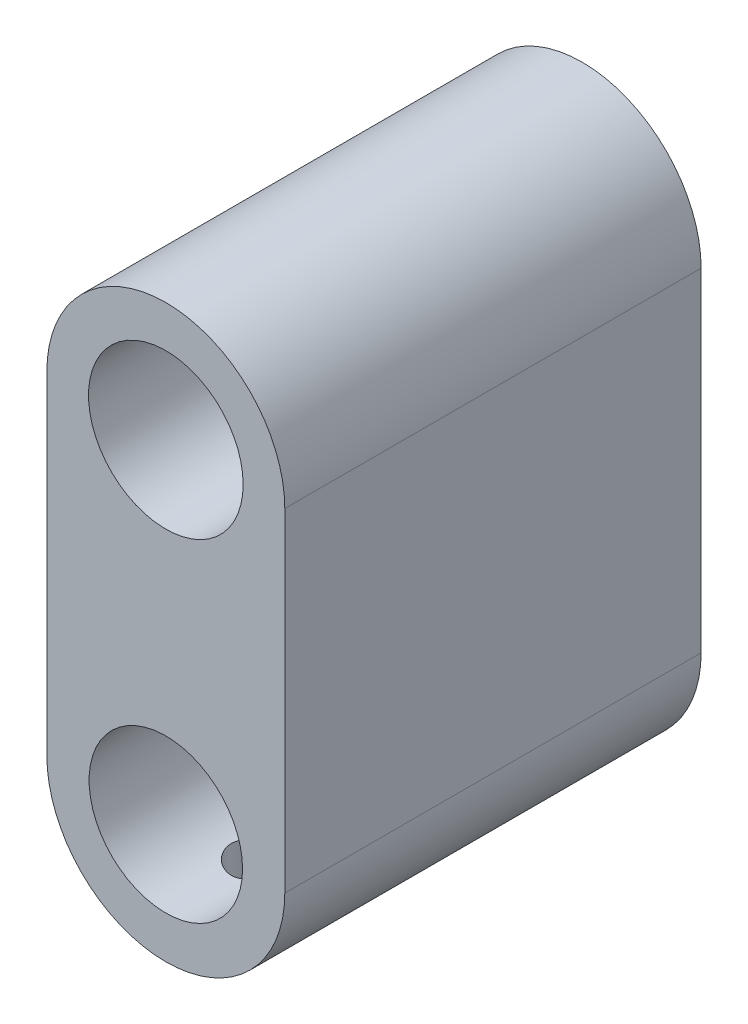
ISO-10303-21;
HEADER;
FILE_DESCRIPTION(('STEP AP214'),'2;1');
FILE_NAME('part.step','',(''),(''),'','','');
FILE_SCHEMA(('AUTOMOTIVE_DESIGN { 1 0 10303 214 1 1 1 1 }'));
ENDSEC;
DATA;
#1=APPLICATION_CONTEXT('core data for automotive mechanical design processes');
#2=APPLICATION_PROTOCOL_DEFINITION('international standard','automotive_design',2000,#1);
#3=PRODUCT_CONTEXT('',#1,'mechanical');
#4=PRODUCT('Part','Part','',(#3));
#5=PRODUCT_RELATED_PRODUCT_CATEGORY('part','',(#4));
#6=PRODUCT_DEFINITION_FORMATION('','',#4);
#7=PRODUCT_DEFINITION_CONTEXT('part definition',#1,'design');
#8=PRODUCT_DEFINITION('design','',#6,#7);
#9=PRODUCT_DEFINITION_SHAPE('','',#8);
#10=(LENGTH_UNIT() NAMED_UNIT(*) SI_UNIT(.MILLI.,.METRE.));
#11=(NAMED_UNIT(*) PLANE_ANGLE_UNIT() SI_UNIT($,.RADIAN.));
#12=(NAMED_UNIT(*) SI_UNIT($,.STERADIAN.) SOLID_ANGLE_UNIT());
#13=UNCERTAINTY_MEASURE_WITH_UNIT(LENGTH_MEASURE(1.E-05),#10,'distance_accuracy_value','');
#14=(GEOMETRIC_REPRESENTATION_CONTEXT(3) GLOBAL_UNCERTAINTY_ASSIGNED_CONTEXT((#13)) GLOBAL_UNIT_ASSIGNED_CONTEXT((#10,
#11,#12)) REPRESENTATION_CONTEXT('',''));
#15=CARTESIAN_POINT('',(0.,0.,0.));
#16=DIRECTION('',(0.,0.,1.));
#17=DIRECTION('',(1.,0.,0.));
#18=AXIS2_PLACEMENT_3D('',#15,#16,#17);
#19=CARTESIAN_POINT('',(0.,28.,35.));
#20=DIRECTION('',(0.,0.,1.));
#21=DIRECTION('',(1.,0.,0.));
#22=AXIS2_PLACEMENT_3D('',#19,#20,#21);
#23=PLANE('',#22);
#24=CARTESIAN_POINT('',(0.,28.,35.));
#25=DIRECTION('',(0.,0.,1.));
#26=DIRECTION('',(1.,0.,0.));
#27=AXIS2_PLACEMENT_3D('',#24,#25,#26);
#28=CIRCLE('',#27,6.5);
#29=CARTESIAN_POINT('',(6.5,28.,35.));
#30=VERTEX_POINT('',#29);
#31=EDGE_CURVE('E120',#30,#30,#28,.T.);
#32=ORIENTED_EDGE('',*,*,#31,.F.);
#33=EDGE_LOOP('',(#32));
#34=FACE_BOUND('',#33,.T.);
#35=CARTESIAN_POINT('',(0.,28.,35.));
#36=DIRECTION('',(0.,0.,1.));
#37=DIRECTION('',(1.,0.,0.));
#38=AXIS2_PLACEMENT_3D('',#35,#36,#37);
#39=CIRCLE('',#38,10.);
#40=CARTESIAN_POINT('',(10.,28.,35.));
#41=VERTEX_POINT('',#40);
#42=CARTESIAN_POINT('',(-10.,28.,35.));
#43=VERTEX_POINT('',#42);
#44=EDGE_CURVE('E99',#41,#43,#39,.T.);
#45=ORIENTED_EDGE('',*,*,#44,.T.);
#46=DIRECTION('',(0.,-1.,0.));
#47=VECTOR('',#46,1.);
#48=CARTESIAN_POINT('',(-10.,28.,35.));
#49=LINE('',#48,#47);
#50=CARTESIAN_POINT('',(-10.,0.,35.));
#51=VERTEX_POINT('',#50);
#52=EDGE_CURVE('E94',#43,#51,#49,.T.);
#53=ORIENTED_EDGE('',*,*,#52,.T.);
#54=CARTESIAN_POINT('',(0.,0.,35.));
#55=DIRECTION('',(0.,0.,1.));
#56=DIRECTION('',(1.,0.,0.));
#57=AXIS2_PLACEMENT_3D('',#54,#55,#56);
#58=CIRCLE('',#57,10.);
#59=CARTESIAN_POINT('',(10.,0.,35.));
#60=VERTEX_POINT('',#59);
#61=EDGE_CURVE('E97',#51,#60,#58,.T.);
#62=ORIENTED_EDGE('',*,*,#61,.T.);
#63=DIRECTION('',(0.,1.,0.));
#64=VECTOR('',#63,1.);
#65=CARTESIAN_POINT('',(10.,28.,35.));
#66=LINE('',#65,#64);
#67=EDGE_CURVE('E64',#60,#41,#66,.T.);
#68=ORIENTED_EDGE('',*,*,#67,.T.);
#69=EDGE_LOOP('',(#45,#53,#62,#68));
#70=FACE_BOUND('',#69,.T.);
#71=CARTESIAN_POINT('',(0.,0.,35.));
#72=DIRECTION('',(0.,0.,1.));
#73=DIRECTION('',(1.,0.,0.));
#74=AXIS2_PLACEMENT_3D('',#71,#72,#73);
#75=CIRCLE('',#74,6.45);
#76=CARTESIAN_POINT('',(6.45,0.,35.));
#77=VERTEX_POINT('',#76);
#78=EDGE_CURVE('E197',#77,#77,#75,.T.);
#79=ORIENTED_EDGE('',*,*,#78,.F.);
#80=EDGE_LOOP('',(#79));
#81=FACE_BOUND('',#80,.T.);
#82=ADVANCED_FACE('F39',(#34,#70,#81),#23,.T.);
#83=CARTESIAN_POINT('',(0.,28.,0.));
#84=DIRECTION('',(0.,0.,1.));
#85=DIRECTION('',(1.,0.,0.));
#86=AXIS2_PLACEMENT_3D('',#83,#84,#85);
#87=PLANE('',#86);
#88=CARTESIAN_POINT('',(0.,28.,0.));
#89=DIRECTION('',(0.,0.,1.));
#90=DIRECTION('',(1.,0.,0.));
#91=AXIS2_PLACEMENT_3D('',#88,#89,#90);
#92=CIRCLE('',#91,10.);
#93=CARTESIAN_POINT('',(10.,28.,0.));
#94=VERTEX_POINT('',#93);
#95=CARTESIAN_POINT('',(-10.,28.,0.));
#96=VERTEX_POINT('',#95);
#97=EDGE_CURVE('E116',#94,#96,#92,.T.);
#98=ORIENTED_EDGE('',*,*,#97,.F.);
#99=DIRECTION('',(0.,1.,0.));
#100=VECTOR('',#99,1.);
#101=CARTESIAN_POINT('',(10.,28.,0.));
#102=LINE('',#101,#100);
#103=CARTESIAN_POINT('',(10.,0.,0.));
#104=VERTEX_POINT('',#103);
#105=EDGE_CURVE('E87',#104,#94,#102,.T.);
#106=ORIENTED_EDGE('',*,*,#105,.F.);
#107=CARTESIAN_POINT('',(0.,0.,0.));
#108=DIRECTION('',(0.,0.,1.));
#109=DIRECTION('',(1.,0.,0.));
#110=AXIS2_PLACEMENT_3D('',#107,#108,#109);
#111=CIRCLE('',#110,10.);
#112=CARTESIAN_POINT('',(-10.,0.,0.));
#113=VERTEX_POINT('',#112);
#114=EDGE_CURVE('E81',#113,#104,#111,.T.);
#115=ORIENTED_EDGE('',*,*,#114,.F.);
#116=DIRECTION('',(0.,-1.,0.));
#117=VECTOR('',#116,1.);
#118=CARTESIAN_POINT('',(-10.,28.,0.));
#119=LINE('',#118,#117);
#120=EDGE_CURVE('E104',#96,#113,#119,.T.);
#121=ORIENTED_EDGE('',*,*,#120,.F.);
#122=EDGE_LOOP('',(#98,#106,#115,#121));
#123=FACE_BOUND('',#122,.T.);
#124=CARTESIAN_POINT('',(0.,28.,0.));
#125=DIRECTION('',(0.,0.,1.));
#126=DIRECTION('',(1.,0.,0.));
#127=AXIS2_PLACEMENT_3D('',#124,#125,#126);
#128=CIRCLE('',#127,6.5);
#129=CARTESIAN_POINT('',(6.5,28.,0.));
#130=VERTEX_POINT('',#129);
#131=EDGE_CURVE('E194',#130,#130,#128,.T.);
#132=ORIENTED_EDGE('',*,*,#131,.T.);
#133=EDGE_LOOP('',(#132));
#134=FACE_BOUND('',#133,.T.);
#135=CARTESIAN_POINT('',(0.,0.,0.));
#136=DIRECTION('',(0.,0.,1.));
#137=DIRECTION('',(1.,0.,0.));
#138=AXIS2_PLACEMENT_3D('',#135,#136,#137);
#139=CIRCLE('',#138,6.45);
#140=CARTESIAN_POINT('',(6.45,0.,0.));
#141=VERTEX_POINT('',#140);
#142=EDGE_CURVE('E203',#141,#141,#139,.T.);
#143=ORIENTED_EDGE('',*,*,#142,.T.);
#144=EDGE_LOOP('',(#143));
#145=FACE_BOUND('',#144,.T.);
#146=ADVANCED_FACE('F172',(#123,#134,#145),#87,.F.);
#147=CARTESIAN_POINT('',(0.,28.,35.));
#148=DIRECTION('',(0.,0.,-1.));
#149=DIRECTION('',(-1.,0.,0.));
#150=AXIS2_PLACEMENT_3D('',#147,#148,#149);
#151=CYLINDRICAL_SURFACE('',#150,10.);
#152=ORIENTED_EDGE('',*,*,#97,.T.);
#153=DIRECTION('',(0.,0.,-1.));
#154=VECTOR('',#153,1.);
#155=CARTESIAN_POINT('',(-10.,28.,35.));
#156=LINE('',#155,#154);
#157=EDGE_CURVE('E11',#43,#96,#156,.T.);
#158=ORIENTED_EDGE('',*,*,#157,.F.);
#159=ORIENTED_EDGE('',*,*,#44,.F.);
#160=DIRECTION('',(0.,0.,-1.));
#161=VECTOR('',#160,1.);
#162=CARTESIAN_POINT('',(10.,28.,35.));
#163=LINE('',#162,#161);
#164=EDGE_CURVE('E112',#41,#94,#163,.T.);
#165=ORIENTED_EDGE('',*,*,#164,.T.);
#166=EDGE_LOOP('',(#152,#158,#159,#165));
#167=FACE_BOUND('',#166,.T.);
#168=ADVANCED_FACE('F41',(#167),#151,.T.);
#169=CARTESIAN_POINT('',(-10.,28.,35.));
#170=DIRECTION('',(1.,0.,0.));
#171=DIRECTION('',(0.,1.,0.));
#172=AXIS2_PLACEMENT_3D('',#169,#170,#171);
#173=PLANE('',#172);
#174=ORIENTED_EDGE('',*,*,#120,.T.);
#175=DIRECTION('',(0.,0.,-1.));
#176=VECTOR('',#175,1.);
#177=CARTESIAN_POINT('',(-10.,0.,35.));
#178=LINE('',#177,#176);
#179=EDGE_CURVE('E55',#51,#113,#178,.T.);
#180=ORIENTED_EDGE('',*,*,#179,.F.);
#181=ORIENTED_EDGE('',*,*,#52,.F.);
#182=ORIENTED_EDGE('',*,*,#157,.T.);
#183=EDGE_LOOP('',(#174,#180,#181,#182));
#184=FACE_BOUND('',#183,.T.);
#185=ADVANCED_FACE('F103',(#184),#173,.F.);
#186=CARTESIAN_POINT('',(0.,0.,35.));
#187=DIRECTION('',(0.,0.,-1.));
#188=DIRECTION('',(-1.,0.,0.));
#189=AXIS2_PLACEMENT_3D('',#186,#187,#188);
#190=CYLINDRICAL_SURFACE('',#189,10.);
#191=CARTESIAN_POINT('',(0.,-10.,9.5));
#192=CARTESIAN_POINT('',(0.111153813585266,-9.99999795161742,9.49999591100331));
#193=CARTESIAN_POINT('',(0.222359320403044,-9.99812770356462,9.49070231406471));
#194=CARTESIAN_POINT('',(0.441627015378038,-9.99084731246462,9.45380299976951));
#195=CARTESIAN_POINT('',(0.549686635082711,-9.98543435720372,9.42618273439698));
#196=CARTESIAN_POINT('',(0.759460610526626,-9.97167298556573,9.35351745275842));
#197=CARTESIAN_POINT('',(0.861180935866269,-9.96332738153436,9.30848912631062));
#198=CARTESIAN_POINT('',(1.05561597772845,-9.94460796070629,9.20233550497741));
#199=CARTESIAN_POINT('',(1.14833123015162,-9.93423426471414,9.14121116878559));
#200=CARTESIAN_POINT('',(1.32338695462973,-9.91244330659939,9.00372301141713));
#201=CARTESIAN_POINT('',(1.40558790231705,-9.90101491008695,8.9271832892176));
#202=CARTESIAN_POINT('',(1.55607351321606,-9.87848360905176,8.76141516721659));
#203=CARTESIAN_POINT('',(1.62435708954085,-9.86738073000847,8.67218577732976));
#204=CARTESIAN_POINT('',(1.74566350669524,-9.8466488362523,8.48256761397625));
#205=CARTESIAN_POINT('',(1.79854187773173,-9.83703414729892,8.38208471240728));
#206=CARTESIAN_POINT('',(1.88661133316062,-9.82052536116835,8.17343636199184));
#207=CARTESIAN_POINT('',(1.92180416487448,-9.81363099523923,8.06527167330731));
#208=CARTESIAN_POINT('',(1.97305059976965,-9.80345610504409,7.84583127218417));
#209=CARTESIAN_POINT('',(1.98934899591755,-9.80012940214375,7.73461491171555));
#210=CARTESIAN_POINT('',(2.00310425545224,-9.79732750121254,7.51098035727132));
#211=CARTESIAN_POINT('',(2.000563045427,-9.79785190935681,7.39856228735971));
#212=CARTESIAN_POINT('',(1.97690914620364,-9.80265102296369,7.17750642395799));
#213=CARTESIAN_POINT('',(1.95607708048781,-9.80686905717527,7.06883718874537));
#214=CARTESIAN_POINT('',(1.8968757692461,-9.81849092320002,6.856567846674));
#215=CARTESIAN_POINT('',(1.85850568620136,-9.82589490715557,6.75296798216198));
#216=CARTESIAN_POINT('',(1.76504956734944,-9.84311237000816,6.5529694765928));
#217=CARTESIAN_POINT('',(1.70985230246423,-9.85294179627409,6.45662424086166));
#218=CARTESIAN_POINT('',(1.58438714914536,-9.87389237546124,6.27445830005437));
#219=CARTESIAN_POINT('',(1.51411752871366,-9.88501367676731,6.18863880629769));
#220=CARTESIAN_POINT('',(1.35899986912117,-9.90754042482923,6.02834119508613));
#221=CARTESIAN_POINT('',(1.27391232242489,-9.91894738421809,5.95409486428174));
#222=CARTESIAN_POINT('',(1.09237004812402,-9.94057697428817,5.82089230739755));
#223=CARTESIAN_POINT('',(0.995915174758779,-9.95079958977947,5.76193627741284));
#224=CARTESIAN_POINT('',(0.794118773757842,-9.96893380321774,5.66094498154805));
#225=CARTESIAN_POINT('',(0.688763639170601,-9.97684177696543,5.61893621271093));
#226=CARTESIAN_POINT('',(0.47229795289733,-9.98942817975716,5.55327905192287));
#227=CARTESIAN_POINT('',(0.3611881001449,-9.99410700001062,5.52962843585274));
#228=CARTESIAN_POINT('',(0.138358811254302,-9.99965343733735,5.50168709241145));
#229=CARTESIAN_POINT('',(0.0266806566511536,-10.0005834930494,5.49707916091946));
#230=CARTESIAN_POINT('',(-0.195849868385427,-9.99870103860205,5.50649971788436));
#231=CARTESIAN_POINT('',(-0.306702284887585,-9.99588873882892,5.52052715870519));
#232=CARTESIAN_POINT('',(-0.52341131989308,-9.98687664016035,5.56655674708791));
#233=CARTESIAN_POINT('',(-0.629303896679805,-9.98070752808413,5.59839613699581));
#234=CARTESIAN_POINT('',(-0.834247254999333,-9.96567104122065,5.67896796531162));
#235=CARTESIAN_POINT('',(-0.933297523275078,-9.95680346428453,5.72770166935366));
#236=CARTESIAN_POINT('',(-1.12308234737243,-9.93719823066589,5.84136498130262));
#237=CARTESIAN_POINT('',(-1.21370025350437,-9.92643900874103,5.90648556207789));
#238=CARTESIAN_POINT('',(-1.38283603823841,-9.90429469659765,6.05081838241456));
#239=CARTESIAN_POINT('',(-1.46135261786152,-9.89290953936776,6.13003213279973));
#240=CARTESIAN_POINT('',(-1.60528118154835,-9.8705860711393,6.30174670378225));
#241=CARTESIAN_POINT('',(-1.67047540489731,-9.85965720466608,6.39443148844267));
#242=CARTESIAN_POINT('',(-1.78437084010241,-9.83968383592388,6.58962272271336));
#243=CARTESIAN_POINT('',(-1.8330727118458,-9.83063925826685,6.6921287791471));
#244=CARTESIAN_POINT('',(-1.91230368316392,-9.81553481168765,6.90353649229909));
#245=CARTESIAN_POINT('',(-1.9429269995821,-9.80945949744373,7.01240168242064));
#246=CARTESIAN_POINT('',(-1.98541730325439,-9.8009487358405,7.23386690698181));
#247=CARTESIAN_POINT('',(-1.99728673645022,-9.79851281382223,7.34646645241869));
#248=CARTESIAN_POINT('',(-2.00184182173494,-9.79758299262758,7.57001772908863));
#249=CARTESIAN_POINT('',(-1.99487157614179,-9.79901838378602,7.68096229785402));
#250=CARTESIAN_POINT('',(-1.96270460820012,-9.80551146969228,7.90006329981005));
#251=CARTESIAN_POINT('',(-1.9375080322586,-9.81056913534338,8.00821975538961));
#252=CARTESIAN_POINT('',(-1.86975713699791,-9.82370528438317,8.21845542248109));
#253=CARTESIAN_POINT('',(-1.82724501343469,-9.83177642037661,8.32054872100483));
#254=CARTESIAN_POINT('',(-1.72610928920321,-9.8500342994834,8.51620744146888));
#255=CARTESIAN_POINT('',(-1.66748433754977,-9.86022121997788,8.60977214745027));
#256=CARTESIAN_POINT('',(-1.53461182957283,-9.8817792104645,8.78743114430062));
#257=CARTESIAN_POINT('',(-1.46011577447036,-9.89316745819399,8.87133753053519));
#258=CARTESIAN_POINT('',(-1.29812873802628,-9.91572163743909,9.02557241105834));
#259=CARTESIAN_POINT('',(-1.21063477430667,-9.92688751726369,9.09589778063454));
#260=CARTESIAN_POINT('',(-1.0240352581765,-9.94787664775943,9.22166928789289));
#261=CARTESIAN_POINT('',(-0.924817768859673,-9.95768462438492,9.27695200656005));
#262=CARTESIAN_POINT('',(-0.718332721881468,-9.9747025017,9.36997224519318));
#263=CARTESIAN_POINT('',(-0.611072521726254,-9.98191474277231,9.40772557906498));
#264=CARTESIAN_POINT('',(-0.419642977847559,-9.99152745190741,9.45730389608943));
#265=CARTESIAN_POINT('',(-0.336563328027569,-9.99468606316903,9.47328638741551));
#266=CARTESIAN_POINT('',(-0.168999050420133,-9.99892308279785,9.49463582471673));
#267=CARTESIAN_POINT('',(-0.0845144674972378,-10.0000015574631,9.50000310901954));
#268=CARTESIAN_POINT('',(0.,-10.,9.5));
#269=B_SPLINE_CURVE_WITH_KNOTS('',3,(#191,#192,#193,#194,#195,#196,#197,#198,#199,#200,#201,
#202,#203,#204,#205,#206,#207,#208,#209,#210,#211,#212,#213,#214,#215,#216,#217,#218,#219,#220,
#221,#222,#223,#224,#225,#226,#227,#228,#229,#230,#231,#232,#233,#234,#235,#236,#237,#238,#239,
#240,#241,#242,#243,#244,#245,#246,#247,#248,#249,#250,#251,#252,#253,#254,#255,#256,#257,#258,
#259,#260,#261,#262,#263,#264,#265,#266,#267,#268),.UNSPECIFIED.,.T.,.F.,(4,2,2,2,2,2,2,2,2,2,2,
2,2,2,2,2,2,2,2,2,2,2,2,2,2,2,2,2,2,2,2,2,2,2,2,2,2,2,4),(0.,0.333152261322517,
0.666569301382645,0.999667470500684,1.33274580446173,1.66986534022437,2.00701119349473,
2.34722390011845,2.68740298730395,3.02312370207175,3.3588100856245,3.68943454012557,
4.02007478507459,4.35294980407185,4.68586309499341,5.02476504982701,5.3636713507964,
5.70310549708048,6.04249851396072,6.3762147135253,6.70991215315735,7.04060907901447,
7.37133078432045,7.70610132066717,8.0409077669186,8.38081257158451,8.72070377446933,
9.05880762065446,9.39686736660829,9.72879445135402,10.0607188698522,10.3918392250622,
10.7229873516373,11.0597615247829,11.3966130906586,11.7369899335127,12.0770591103504,
12.3303755057979,12.5836838274199),.UNSPECIFIED.);
#270=CARTESIAN_POINT('',(0.,-10.,9.5));
#271=VERTEX_POINT('',#270);
#272=EDGE_CURVE('E156',#271,#271,#269,.T.);
#273=ORIENTED_EDGE('',*,*,#272,.T.);
#274=EDGE_LOOP('',(#273));
#275=FACE_BOUND('',#274,.T.);
#276=CARTESIAN_POINT('',(0.,-10.,29.5));
#277=CARTESIAN_POINT('',(0.111153813585266,-9.99999795161742,29.4999959110033));
#278=CARTESIAN_POINT('',(0.222359320403044,-9.99812770356462,29.4907023140647));
#279=CARTESIAN_POINT('',(0.441627015378038,-9.99084731246462,29.4538029997695));
#280=CARTESIAN_POINT('',(0.549686635082712,-9.98543435720372,29.426182734397));
#281=CARTESIAN_POINT('',(0.759460610526626,-9.97167298556573,29.3535174527584));
#282=CARTESIAN_POINT('',(0.861180935866269,-9.96332738153436,29.3084891263106));
#283=CARTESIAN_POINT('',(1.05561597772845,-9.94460796070629,29.2023355049774));
#284=CARTESIAN_POINT('',(1.14833123015162,-9.93423426471414,29.1412111687856));
#285=CARTESIAN_POINT('',(1.32338695462973,-9.91244330659939,29.0037230114171));
#286=CARTESIAN_POINT('',(1.40558790231705,-9.90101491008695,28.9271832892176));
#287=CARTESIAN_POINT('',(1.55607351321606,-9.87848360905176,28.7614151672166));
#288=CARTESIAN_POINT('',(1.62435708954085,-9.86738073000847,28.6721857773298));
#289=CARTESIAN_POINT('',(1.74566350669524,-9.8466488362523,28.4825676139763));
#290=CARTESIAN_POINT('',(1.79854187773173,-9.83703414729892,28.3820847124073));
#291=CARTESIAN_POINT('',(1.88661133316062,-9.82052536116835,28.1734363619918));
#292=CARTESIAN_POINT('',(1.92180416487448,-9.81363099523923,28.0652716733073));
#293=CARTESIAN_POINT('',(1.97305059976965,-9.80345610504409,27.8458312721842));
#294=CARTESIAN_POINT('',(1.98934899591755,-9.80012940214375,27.7346149117155));
#295=CARTESIAN_POINT('',(2.00310425545224,-9.79732750121254,27.5109803572713));
#296=CARTESIAN_POINT('',(2.000563045427,-9.79785190935681,27.3985622873597));
#297=CARTESIAN_POINT('',(1.97690914620364,-9.80265102296369,27.177506423958));
#298=CARTESIAN_POINT('',(1.95607708048781,-9.80686905717527,27.0688371887454));
#299=CARTESIAN_POINT('',(1.8968757692461,-9.81849092320002,26.856567846674));
#300=CARTESIAN_POINT('',(1.85850568620136,-9.82589490715557,26.752967982162));
#301=CARTESIAN_POINT('',(1.76504956734944,-9.84311237000816,26.5529694765928));
#302=CARTESIAN_POINT('',(1.70985230246423,-9.85294179627409,26.4566242408617));
#303=CARTESIAN_POINT('',(1.58438714914536,-9.87389237546124,26.2744583000544));
#304=CARTESIAN_POINT('',(1.51411752871366,-9.88501367676731,26.1886388062977));
#305=CARTESIAN_POINT('',(1.35899986912117,-9.90754042482923,26.0283411950861));
#306=CARTESIAN_POINT('',(1.27391232242489,-9.91894738421809,25.9540948642817));
#307=CARTESIAN_POINT('',(1.09237004812402,-9.94057697428817,25.8208923073976));
#308=CARTESIAN_POINT('',(0.995915174758779,-9.95079958977947,25.7619362774129));
#309=CARTESIAN_POINT('',(0.794118773757843,-9.96893380321774,25.6609449815481));
#310=CARTESIAN_POINT('',(0.688763639170602,-9.97684177696543,25.6189362127109));
#311=CARTESIAN_POINT('',(0.472297952897331,-9.98942817975716,25.5532790519229));
#312=CARTESIAN_POINT('',(0.3611881001449,-9.99410700001062,25.5296284358528));
#313=CARTESIAN_POINT('',(0.138358811254301,-9.99965343733735,25.5016870924115));
#314=CARTESIAN_POINT('',(0.0266806566511526,-10.0005834930494,25.4970791609195));
#315=CARTESIAN_POINT('',(-0.195849868385428,-9.99870103860205,25.5064997178844));
#316=CARTESIAN_POINT('',(-0.306702284887587,-9.99588873882892,25.5205271587052));
#317=CARTESIAN_POINT('',(-0.523411319893083,-9.98687664016035,25.5665567470879));
#318=CARTESIAN_POINT('',(-0.629303896679809,-9.98070752808413,25.5983961369958));
#319=CARTESIAN_POINT('',(-0.834247254999337,-9.96567104122065,25.6789679653116));
#320=CARTESIAN_POINT('',(-0.933297523275081,-9.95680346428453,25.7277016693537));
#321=CARTESIAN_POINT('',(-1.12308234737244,-9.93719823066589,25.8413649813026));
#322=CARTESIAN_POINT('',(-1.21370025350438,-9.92643900874103,25.9064855620779));
#323=CARTESIAN_POINT('',(-1.38283603823842,-9.90429469659765,26.0508183824146));
#324=CARTESIAN_POINT('',(-1.46135261786153,-9.89290953936776,26.1300321327997));
#325=CARTESIAN_POINT('',(-1.60528118154835,-9.8705860711393,26.3017467037823));
#326=CARTESIAN_POINT('',(-1.67047540489731,-9.85965720466608,26.3944314884427));
#327=CARTESIAN_POINT('',(-1.78437084010241,-9.83968383592388,26.5896227227134));
#328=CARTESIAN_POINT('',(-1.83307271184581,-9.83063925826685,26.6921287791471));
#329=CARTESIAN_POINT('',(-1.91230368316392,-9.81553481168766,26.9035364922991));
#330=CARTESIAN_POINT('',(-1.9429269995821,-9.80945949744373,27.0124016824206));
#331=CARTESIAN_POINT('',(-1.98541730325439,-9.8009487358405,27.2338669069818));
#332=CARTESIAN_POINT('',(-1.99728673645023,-9.79851281382223,27.3464664524187));
#333=CARTESIAN_POINT('',(-2.00184182173494,-9.79758299262758,27.5700177290886));
#334=CARTESIAN_POINT('',(-1.99487157614179,-9.79901838378602,27.680962297854));
#335=CARTESIAN_POINT('',(-1.96270460820012,-9.80551146969228,27.9000632998101));
#336=CARTESIAN_POINT('',(-1.9375080322586,-9.81056913534338,28.0082197553896));
#337=CARTESIAN_POINT('',(-1.86975713699791,-9.82370528438317,28.2184554224811));
#338=CARTESIAN_POINT('',(-1.82724501343469,-9.83177642037661,28.3205487210048));
#339=CARTESIAN_POINT('',(-1.72610928920321,-9.8500342994834,28.5162074414689));
#340=CARTESIAN_POINT('',(-1.66748433754976,-9.86022121997788,28.6097721474503));
#341=CARTESIAN_POINT('',(-1.53461182957283,-9.88177921046451,28.7874311443006));
#342=CARTESIAN_POINT('',(-1.46011577447036,-9.89316745819399,28.8713375305352));
#343=CARTESIAN_POINT('',(-1.29812873802628,-9.91572163743909,29.0255724110583));
#344=CARTESIAN_POINT('',(-1.21063477430667,-9.92688751726369,29.0958977806345));
#345=CARTESIAN_POINT('',(-1.02403525817649,-9.94787664775943,29.2216692878929));
#346=CARTESIAN_POINT('',(-0.924817768859669,-9.95768462438492,29.2769520065601));
#347=CARTESIAN_POINT('',(-0.718332721881464,-9.9747025017,29.3699722451932));
#348=CARTESIAN_POINT('',(-0.61107252172625,-9.98191474277231,29.407725579065));
#349=CARTESIAN_POINT('',(-0.419642977847557,-9.99152745190741,29.4573038960894));
#350=CARTESIAN_POINT('',(-0.336563328027568,-9.99468606316903,29.4732863874155));
#351=CARTESIAN_POINT('',(-0.168999050420133,-9.99892308279785,29.4946358247167));
#352=CARTESIAN_POINT('',(-0.0845144674972378,-10.0000015574631,29.5000031090195));
#353=CARTESIAN_POINT('',(0.,-10.,29.5));
#354=B_SPLINE_CURVE_WITH_KNOTS('',3,(#276,#277,#278,#279,#280,#281,#282,#283,#284,#285,#286,
#287,#288,#289,#290,#291,#292,#293,#294,#295,#296,#297,#298,#299,#300,#301,#302,#303,#304,#305,
#306,#307,#308,#309,#310,#311,#312,#313,#314,#315,#316,#317,#318,#319,#320,#321,#322,#323,#324,
#325,#326,#327,#328,#329,#330,#331,#332,#333,#334,#335,#336,#337,#338,#339,#340,#341,#342,#343,
#344,#345,#346,#347,#348,#349,#350,#351,#352,#353),.UNSPECIFIED.,.T.,.F.,(4,2,2,2,2,2,2,2,2,2,2,
2,2,2,2,2,2,2,2,2,2,2,2,2,2,2,2,2,2,2,2,2,2,2,2,2,2,2,4),(0.,0.333152261322516,
0.666569301382646,0.999667470500684,1.33274580446173,1.66986534022437,2.00701119349473,
2.34722390011846,2.68740298730395,3.02312370207175,3.3588100856245,3.68943454012557,
4.02007478507459,4.35294980407185,4.68586309499341,5.02476504982701,5.3636713507964,
5.70310549708048,6.04249851396072,6.37621471352531,6.70991215315735,7.04060907901447,
7.37133078432045,7.70610132066718,8.0409077669186,8.38081257158452,8.72070377446933,
9.05880762065446,9.3968673666083,9.72879445135403,10.0607188698522,10.3918392250622,
10.7229873516373,11.0597615247829,11.3966130906586,11.7369899335127,12.0770591103504,
12.3303755057979,12.5836838274199),.UNSPECIFIED.);
#355=CARTESIAN_POINT('',(0.,-10.,29.5));
#356=VERTEX_POINT('',#355);
#357=EDGE_CURVE('E137',#356,#356,#354,.T.);
#358=ORIENTED_EDGE('',*,*,#357,.T.);
#359=EDGE_LOOP('',(#358));
#360=FACE_BOUND('',#359,.T.);
#361=ORIENTED_EDGE('',*,*,#114,.T.);
#362=DIRECTION('',(0.,0.,-1.));
#363=VECTOR('',#362,1.);
#364=CARTESIAN_POINT('',(10.,0.,35.));
#365=LINE('',#364,#363);
#366=EDGE_CURVE('E106',#60,#104,#365,.T.);
#367=ORIENTED_EDGE('',*,*,#366,.F.);
#368=ORIENTED_EDGE('',*,*,#61,.F.);
#369=ORIENTED_EDGE('',*,*,#179,.T.);
#370=EDGE_LOOP('',(#361,#367,#368,#369));
#371=FACE_BOUND('',#370,.T.);
#372=ADVANCED_FACE('F108',(#275,#360,#371),#190,.T.);
#373=CARTESIAN_POINT('',(10.,28.,35.));
#374=DIRECTION('',(-1.,0.,0.));
#375=DIRECTION('',(0.,-1.,0.));
#376=AXIS2_PLACEMENT_3D('',#373,#374,#375);
#377=PLANE('',#376);
#378=ORIENTED_EDGE('',*,*,#105,.T.);
#379=ORIENTED_EDGE('',*,*,#164,.F.);
#380=ORIENTED_EDGE('',*,*,#67,.F.);
#381=ORIENTED_EDGE('',*,*,#366,.T.);
#382=EDGE_LOOP('',(#378,#379,#380,#381));
#383=FACE_BOUND('',#382,.T.);
#384=ADVANCED_FACE('F164',(#383),#377,.F.);
#385=CARTESIAN_POINT('',(0.,28.,35.));
#386=DIRECTION('',(0.,0.,-1.));
#387=DIRECTION('',(-1.,0.,0.));
#388=AXIS2_PLACEMENT_3D('',#385,#386,#387);
#389=CYLINDRICAL_SURFACE('',#388,6.5);
#390=ORIENTED_EDGE('',*,*,#31,.T.);
#391=EDGE_LOOP('',(#390));
#392=FACE_BOUND('',#391,.T.);
#393=ORIENTED_EDGE('',*,*,#131,.F.);
#394=EDGE_LOOP('',(#393));
#395=FACE_BOUND('',#394,.T.);
#396=ADVANCED_FACE('F182',(#392,#395),#389,.F.);
#397=CARTESIAN_POINT('',(0.,0.,35.));
#398=DIRECTION('',(0.,0.,-1.));
#399=DIRECTION('',(-1.,0.,0.));
#400=AXIS2_PLACEMENT_3D('',#397,#398,#399);
#401=CYLINDRICAL_SURFACE('',#400,6.45);
#402=CARTESIAN_POINT('',(0.,-6.45,9.5));
#403=CARTESIAN_POINT('',(0.10954504997031,-6.44999937082872,9.49999915975739));
#404=CARTESIAN_POINT('',(0.219098768865394,-6.44718286647698,9.49097021822915));
#405=CARTESIAN_POINT('',(0.435005048866286,-6.43622305752618,9.45518591129139));
#406=CARTESIAN_POINT('',(0.541356833986456,-6.42807847237005,9.42842628444872));
#407=CARTESIAN_POINT('',(0.747714493196124,-6.4073527673305,9.35816784909514));
#408=CARTESIAN_POINT('',(0.84772982731428,-6.39477845422092,9.31469471345763));
#409=CARTESIAN_POINT('',(1.03905134798937,-6.3664933006377,9.21235175609317));
#410=CARTESIAN_POINT('',(1.1303562004343,-6.35078198083096,9.15347958097377));
#411=CARTESIAN_POINT('',(1.30444635993071,-6.31735689941251,9.02012173163738));
#412=CARTESIAN_POINT('',(1.38692907447787,-6.29960001497437,8.94525188892015));
#413=CARTESIAN_POINT('',(1.53839194931145,-6.26433634720094,8.78284211769266));
#414=CARTESIAN_POINT('',(1.60736964454813,-6.24682961006423,8.69529988117314));
#415=CARTESIAN_POINT('',(1.7314956588936,-6.2135869743888,8.50742242093706));
#416=CARTESIAN_POINT('',(1.78626767345013,-6.1979043715571,8.40682825904139));
#417=CARTESIAN_POINT('',(1.87799198722357,-6.1707334334357,8.19729179370257));
#418=CARTESIAN_POINT('',(1.91494889829264,-6.15924401283094,8.08835165927993));
#419=CARTESIAN_POINT('',(1.96888987156494,-6.14221104960248,7.868626975006));
#420=CARTESIAN_POINT('',(1.98643457109778,-6.13650103636296,7.75799331942876));
#421=CARTESIAN_POINT('',(2.00280443625806,-6.13117894555022,7.5352167516602));
#422=CARTESIAN_POINT('',(2.00163449059855,-6.13156527546597,7.42307424126553));
#423=CARTESIAN_POINT('',(1.98104713577205,-6.13824516092598,7.20508530395909));
#424=CARTESIAN_POINT('',(1.96234037126369,-6.14430864902989,7.09916352878847));
#425=CARTESIAN_POINT('',(1.90836181069695,-6.16128620226793,6.89204282566254));
#426=CARTESIAN_POINT('',(1.87308827893286,-6.17220077564545,6.79084439379513));
#427=CARTESIAN_POINT('',(1.786471391391,-6.19782845263085,6.59434122880768));
#428=CARTESIAN_POINT('',(1.73490345382132,-6.21259410538365,6.49914263666752));
#429=CARTESIAN_POINT('',(1.61731757270232,-6.24423591619589,6.31851591605279));
#430=CARTESIAN_POINT('',(1.55129592440067,-6.26111261487903,6.23309030113545));
#431=CARTESIAN_POINT('',(1.40318126966951,-6.29599989239408,6.07041429758583));
#432=CARTESIAN_POINT('',(1.32050099174055,-6.31402740493056,5.993701273178));
#433=CARTESIAN_POINT('',(1.1432249816875,-6.34851792872681,5.85509985529674));
#434=CARTESIAN_POINT('',(1.04862839457563,-6.36498082757766,5.79321252648322));
#435=CARTESIAN_POINT('',(0.849181029510386,-6.39465552131379,5.6856626470822));
#436=CARTESIAN_POINT('',(0.744258029113968,-6.40784175437198,5.64012650160464));
#437=CARTESIAN_POINT('',(0.527737642167929,-6.42929293477216,5.5675091939285));
#438=CARTESIAN_POINT('',(0.416142260546075,-6.43755935233123,5.54042251801777));
#439=CARTESIAN_POINT('',(0.194007547022158,-6.44800371696016,5.5063843332294));
#440=CARTESIAN_POINT('',(0.0835898860106795,-6.45040157166617,5.49870520391828));
#441=CARTESIAN_POINT('',(-0.136967218412056,-6.44948799615208,5.50165095425568));
#442=CARTESIAN_POINT('',(-0.247106699496587,-6.4461773856929,5.51227320574461));
#443=CARTESIAN_POINT('',(-0.461186297170989,-6.43436326240413,5.55093521097915));
#444=CARTESIAN_POINT('',(-0.565212110833329,-6.42598846132525,5.57854353995784));
#445=CARTESIAN_POINT('',(-0.767127265717498,-6.40502364955077,5.64986902412736));
#446=CARTESIAN_POINT('',(-0.865015850946858,-6.39243312076232,5.69358815932595));
#447=CARTESIAN_POINT('',(-1.05450584878727,-6.3639551634474,5.79707527251844));
#448=CARTESIAN_POINT('',(-1.14589841183395,-6.34799547654217,5.85720523530678));
#449=CARTESIAN_POINT('',(-1.31754085531554,-6.31460563795238,5.99137175590094));
#450=CARTESIAN_POINT('',(-1.39778774818271,-6.29717509401342,6.06541202986509));
#451=CARTESIAN_POINT('',(-1.54810630517703,-6.2619537615593,6.22871916971402));
#452=CARTESIAN_POINT('',(-1.61765952998875,-6.24417540800123,6.31846699846799));
#453=CARTESIAN_POINT('',(-1.74076277323808,-6.21098415077954,6.5087468562158));
#454=CARTESIAN_POINT('',(-1.79431308154171,-6.19557120427299,6.60927868983063));
#455=CARTESIAN_POINT('',(-1.8835501811956,-6.16902833407111,6.81804140763921));
#456=CARTESIAN_POINT('',(-1.9193091751027,-6.15788114191844,6.92623910312677));
#457=CARTESIAN_POINT('',(-1.97197675731013,-6.14122019846024,7.14753533041533));
#458=CARTESIAN_POINT('',(-1.9888923760173,-6.13570434618286,7.26063201804457));
#459=CARTESIAN_POINT('',(-2.00289338252918,-6.13114720291212,7.4831028576903));
#460=CARTESIAN_POINT('',(-2.00082819159641,-6.1318285622114,7.59241853896973));
#461=CARTESIAN_POINT('',(-1.97897222004319,-6.13891667529491,7.80906456604293));
#462=CARTESIAN_POINT('',(-1.95918224254891,-6.14532316966807,7.91639500156508));
#463=CARTESIAN_POINT('',(-1.90300315917328,-6.16294740191592,8.12453060954815));
#464=CARTESIAN_POINT('',(-1.86685354303521,-6.17409558894294,8.22540675640851));
#465=CARTESIAN_POINT('',(-1.77916945836328,-6.19993028292376,8.41974256068595));
#466=CARTESIAN_POINT('',(-1.72763189540042,-6.21461750144203,8.51320072159852));
#467=CARTESIAN_POINT('',(-1.60830779652088,-6.24658272215817,8.6939520076803));
#468=CARTESIAN_POINT('',(-1.53997086310609,-6.26393884239413,8.78086793966451));
#469=CARTESIAN_POINT('',(-1.38996070376675,-6.29892313283277,8.94227381493884));
#470=CARTESIAN_POINT('',(-1.30828393233211,-6.31655137422982,9.01676044405456));
#471=CARTESIAN_POINT('',(-1.13077023671562,-6.35076965428097,9.15357501958688));
#472=CARTESIAN_POINT('',(-1.03456409943001,-6.36730848573053,9.21543813426308));
#473=CARTESIAN_POINT('',(-0.832604684975425,-6.39684760686212,9.32202999134299));
#474=CARTESIAN_POINT('',(-0.726855324937582,-6.40984933967056,9.36676572471421));
#475=CARTESIAN_POINT('',(-0.518532065408771,-6.42989770126208,9.43443322837372));
#476=CARTESIAN_POINT('',(-0.41651270877787,-6.43737123543452,9.45895077330799));
#477=CARTESIAN_POINT('',(-0.209664513310219,-6.44742220839157,9.4917329761705));
#478=CARTESIAN_POINT('',(-0.10483622649036,-6.45000060212618,9.50000080412456));
#479=CARTESIAN_POINT('',(0.,-6.45,9.5));
#480=B_SPLINE_CURVE_WITH_KNOTS('',3,(#402,#403,#404,#405,#406,#407,#408,#409,#410,#411,#412,
#413,#414,#415,#416,#417,#418,#419,#420,#421,#422,#423,#424,#425,#426,#427,#428,#429,#430,#431,
#432,#433,#434,#435,#436,#437,#438,#439,#440,#441,#442,#443,#444,#445,#446,#447,#448,#449,#450,
#451,#452,#453,#454,#455,#456,#457,#458,#459,#460,#461,#462,#463,#464,#465,#466,#467,#468,#469,
#470,#471,#472,#473,#474,#475,#476,#477,#478,#479),.UNSPECIFIED.,.T.,.F.,(4,2,2,2,2,2,2,2,2,2,2,
2,2,2,2,2,2,2,2,2,2,2,2,2,2,2,2,2,2,2,2,2,2,2,2,2,2,2,4),(0.,0.328249856546671,
0.656578634039455,0.984405082481394,1.31228166103172,1.64915681730377,1.9860934056556,
2.33120814058122,2.67623348652188,3.01101074437009,3.34570055181793,3.66738830128636,
3.98910976160816,4.31547449746424,4.64192298476145,4.98298938179699,5.32408026408783,
5.66775394154947,6.01132486537229,6.34180973214878,6.67224714378547,6.9946197888141,
7.31703206645479,7.64722836191636,7.97751299552135,8.32066968235397,8.66382015310137,
9.00556641831647,9.34718513627455,9.67359300054369,9.99998607572477,10.3217483315982,
10.6435753356689,10.9778242339214,11.3121621150496,11.6571885271793,12.0020739576539,
12.3162752067657,12.6304151548116),.UNSPECIFIED.);
#481=CARTESIAN_POINT('',(0.,-6.45,9.5));
#482=VERTEX_POINT('',#481);
#483=EDGE_CURVE('E43',#482,#482,#480,.T.);
#484=ORIENTED_EDGE('',*,*,#483,.F.);
#485=EDGE_LOOP('',(#484));
#486=FACE_BOUND('',#485,.T.);
#487=CARTESIAN_POINT('',(0.,-6.45,29.5));
#488=CARTESIAN_POINT('',(0.10954504997031,-6.44999937082872,29.4999991597574));
#489=CARTESIAN_POINT('',(0.219098768865394,-6.44718286647698,29.4909702182292));
#490=CARTESIAN_POINT('',(0.435005048866287,-6.43622305752618,29.4551859112914));
#491=CARTESIAN_POINT('',(0.541356833986456,-6.42807847237005,29.4284262844487));
#492=CARTESIAN_POINT('',(0.747714493196126,-6.4073527673305,29.3581678490951));
#493=CARTESIAN_POINT('',(0.847729827314285,-6.39477845422092,29.3146947134576));
#494=CARTESIAN_POINT('',(1.03905134798938,-6.3664933006377,29.2123517560932));
#495=CARTESIAN_POINT('',(1.13035620043431,-6.35078198083096,29.1534795809738));
#496=CARTESIAN_POINT('',(1.30444635993071,-6.31735689941251,29.0201217316374));
#497=CARTESIAN_POINT('',(1.38692907447787,-6.29960001497437,28.9452518889201));
#498=CARTESIAN_POINT('',(1.53839194931145,-6.26433634720094,28.7828421176927));
#499=CARTESIAN_POINT('',(1.60736964454813,-6.24682961006423,28.6952998811731));
#500=CARTESIAN_POINT('',(1.7314956588936,-6.2135869743888,28.5074224209371));
#501=CARTESIAN_POINT('',(1.78626767345013,-6.1979043715571,28.4068282590414));
#502=CARTESIAN_POINT('',(1.87799198722357,-6.1707334334357,28.1972917937026));
#503=CARTESIAN_POINT('',(1.91494889829264,-6.15924401283094,28.0883516592799));
#504=CARTESIAN_POINT('',(1.96888987156494,-6.14221104960248,27.868626975006));
#505=CARTESIAN_POINT('',(1.98643457109778,-6.13650103636296,27.7579933194288));
#506=CARTESIAN_POINT('',(2.00280443625806,-6.13117894555022,27.5352167516602));
#507=CARTESIAN_POINT('',(2.00163449059855,-6.13156527546597,27.4230742412655));
#508=CARTESIAN_POINT('',(1.98104713577205,-6.13824516092598,27.2050853039591));
#509=CARTESIAN_POINT('',(1.96234037126369,-6.14430864902989,27.0991635287885));
#510=CARTESIAN_POINT('',(1.90836181069695,-6.16128620226793,26.8920428256625));
#511=CARTESIAN_POINT('',(1.87308827893286,-6.17220077564545,26.7908443937951));
#512=CARTESIAN_POINT('',(1.786471391391,-6.19782845263085,26.5943412288077));
#513=CARTESIAN_POINT('',(1.73490345382132,-6.21259410538365,26.4991426366675));
#514=CARTESIAN_POINT('',(1.61731757270232,-6.24423591619589,26.3185159160528));
#515=CARTESIAN_POINT('',(1.55129592440068,-6.26111261487903,26.2330903011355));
#516=CARTESIAN_POINT('',(1.40318126966951,-6.29599989239408,26.0704142975858));
#517=CARTESIAN_POINT('',(1.32050099174055,-6.31402740493056,25.993701273178));
#518=CARTESIAN_POINT('',(1.1432249816875,-6.34851792872681,25.8550998552967));
#519=CARTESIAN_POINT('',(1.04862839457563,-6.36498082757766,25.7932125264832));
#520=CARTESIAN_POINT('',(0.849181029510386,-6.39465552131379,25.6856626470822));
#521=CARTESIAN_POINT('',(0.744258029113968,-6.40784175437198,25.6401265016046));
#522=CARTESIAN_POINT('',(0.527737642167929,-6.42929293477216,25.5675091939285));
#523=CARTESIAN_POINT('',(0.416142260546075,-6.43755935233123,25.5404225180178));
#524=CARTESIAN_POINT('',(0.194007547022158,-6.44800371696016,25.5063843332294));
#525=CARTESIAN_POINT('',(0.0835898860106798,-6.45040157166617,25.4987052039183));
#526=CARTESIAN_POINT('',(-0.136967218412056,-6.44948799615208,25.5016509542557));
#527=CARTESIAN_POINT('',(-0.247106699496587,-6.4461773856929,25.5122732057446));
#528=CARTESIAN_POINT('',(-0.46118629717099,-6.43436326240413,25.5509352109792));
#529=CARTESIAN_POINT('',(-0.565212110833329,-6.42598846132525,25.5785435399578));
#530=CARTESIAN_POINT('',(-0.767127265717499,-6.40502364955077,25.6498690241274));
#531=CARTESIAN_POINT('',(-0.865015850946859,-6.39243312076232,25.6935881593259));
#532=CARTESIAN_POINT('',(-1.05450584878727,-6.3639551634474,25.7970752725184));
#533=CARTESIAN_POINT('',(-1.14589841183395,-6.34799547654217,25.8572052353068));
#534=CARTESIAN_POINT('',(-1.31754085531555,-6.31460563795238,25.9913717559009));
#535=CARTESIAN_POINT('',(-1.39778774818271,-6.29717509401342,26.0654120298651));
#536=CARTESIAN_POINT('',(-1.54810630517703,-6.2619537615593,26.228719169714));
#537=CARTESIAN_POINT('',(-1.61765952998875,-6.24417540800123,26.318466998468));
#538=CARTESIAN_POINT('',(-1.74076277323808,-6.21098415077954,26.5087468562158));
#539=CARTESIAN_POINT('',(-1.79431308154171,-6.19557120427299,26.6092786898306));
#540=CARTESIAN_POINT('',(-1.8835501811956,-6.16902833407111,26.8180414076392));
#541=CARTESIAN_POINT('',(-1.9193091751027,-6.15788114191844,26.9262391031268));
#542=CARTESIAN_POINT('',(-1.97197675731013,-6.14122019846024,27.1475353304153));
#543=CARTESIAN_POINT('',(-1.9888923760173,-6.13570434618286,27.2606320180446));
#544=CARTESIAN_POINT('',(-2.00289338252918,-6.13114720291212,27.4831028576903));
#545=CARTESIAN_POINT('',(-2.00082819159641,-6.1318285622114,27.5924185389697));
#546=CARTESIAN_POINT('',(-1.97897222004319,-6.13891667529491,27.8090645660429));
#547=CARTESIAN_POINT('',(-1.95918224254891,-6.14532316966807,27.9163950015651));
#548=CARTESIAN_POINT('',(-1.90300315917328,-6.16294740191592,28.1245306095482));
#549=CARTESIAN_POINT('',(-1.86685354303521,-6.17409558894294,28.2254067564085));
#550=CARTESIAN_POINT('',(-1.77916945836328,-6.19993028292376,28.419742560686));
#551=CARTESIAN_POINT('',(-1.72763189540042,-6.21461750144203,28.5132007215985));
#552=CARTESIAN_POINT('',(-1.60830779652088,-6.24658272215817,28.6939520076803));
#553=CARTESIAN_POINT('',(-1.53997086310609,-6.26393884239413,28.7808679396645));
#554=CARTESIAN_POINT('',(-1.38996070376675,-6.29892313283277,28.9422738149388));
#555=CARTESIAN_POINT('',(-1.30828393233211,-6.31655137422982,29.0167604440546));
#556=CARTESIAN_POINT('',(-1.13077023671562,-6.35076965428097,29.1535750195869));
#557=CARTESIAN_POINT('',(-1.03456409943001,-6.36730848573053,29.2154381342631));
#558=CARTESIAN_POINT('',(-0.832604684975426,-6.39684760686212,29.322029991343));
#559=CARTESIAN_POINT('',(-0.726855324937584,-6.40984933967056,29.3667657247142));
#560=CARTESIAN_POINT('',(-0.518532065408773,-6.42989770126208,29.4344332283737));
#561=CARTESIAN_POINT('',(-0.416512708777872,-6.43737123543452,29.458950773308));
#562=CARTESIAN_POINT('',(-0.20966451331022,-6.44742220839157,29.4917329761705));
#563=CARTESIAN_POINT('',(-0.104836226490361,-6.45000060212618,29.5000008041246));
#564=CARTESIAN_POINT('',(0.,-6.45,29.5));
#565=B_SPLINE_CURVE_WITH_KNOTS('',3,(#487,#488,#489,#490,#491,#492,#493,#494,#495,#496,#497,
#498,#499,#500,#501,#502,#503,#504,#505,#506,#507,#508,#509,#510,#511,#512,#513,#514,#515,#516,
#517,#518,#519,#520,#521,#522,#523,#524,#525,#526,#527,#528,#529,#530,#531,#532,#533,#534,#535,
#536,#537,#538,#539,#540,#541,#542,#543,#544,#545,#546,#547,#548,#549,#550,#551,#552,#553,#554,
#555,#556,#557,#558,#559,#560,#561,#562,#563,#564),.UNSPECIFIED.,.T.,.F.,(4,2,2,2,2,2,2,2,2,2,2,
2,2,2,2,2,2,2,2,2,2,2,2,2,2,2,2,2,2,2,2,2,2,2,2,2,2,2,4),(0.,0.328249856546672,
0.656578634039457,0.984405082481401,1.31228166103172,1.64915681730378,1.98609340565561,
2.33120814058122,2.67623348652188,3.01101074437009,3.34570055181793,3.66738830128637,
3.98910976160816,4.31547449746424,4.64192298476145,4.98298938179699,5.32408026408782,
5.66775394154947,6.01132486537229,6.34180973214878,6.67224714378547,6.9946197888141,
7.31703206645479,7.64722836191636,7.97751299552135,8.32066968235396,8.66382015310137,
9.00556641831647,9.34718513627455,9.67359300054369,9.99998607572477,10.3217483315982,
10.6435753356689,10.9778242339214,11.3121621150496,11.6571885271793,12.0020739576539,
12.3162752067657,12.6304151548116),.UNSPECIFIED.);
#566=CARTESIAN_POINT('',(0.,-6.45,29.5));
#567=VERTEX_POINT('',#566);
#568=EDGE_CURVE('E130',#567,#567,#565,.T.);
#569=ORIENTED_EDGE('',*,*,#568,.F.);
#570=EDGE_LOOP('',(#569));
#571=FACE_BOUND('',#570,.T.);
#572=ORIENTED_EDGE('',*,*,#78,.T.);
#573=EDGE_LOOP('',(#572));
#574=FACE_BOUND('',#573,.T.);
#575=ORIENTED_EDGE('',*,*,#142,.F.);
#576=EDGE_LOOP('',(#575));
#577=FACE_BOUND('',#576,.T.);
#578=ADVANCED_FACE('F138',(#486,#571,#574,#577),#401,.F.);
#579=CARTESIAN_POINT('',(0.,-10.,27.5));
#580=DIRECTION('',(0.,1.,0.));
#581=DIRECTION('',(0.,0.,1.));
#582=AXIS2_PLACEMENT_3D('',#579,#580,#581);
#583=CYLINDRICAL_SURFACE('',#582,2.);
#584=ORIENTED_EDGE('',*,*,#568,.T.);
#585=EDGE_LOOP('',(#584));
#586=FACE_BOUND('',#585,.T.);
#587=ORIENTED_EDGE('',*,*,#357,.F.);
#588=EDGE_LOOP('',(#587));
#589=FACE_BOUND('',#588,.T.);
#590=ADVANCED_FACE('F141',(#586,#589),#583,.F.);
#591=CARTESIAN_POINT('',(0.,-10.,7.5));
#592=DIRECTION('',(0.,1.,0.));
#593=DIRECTION('',(0.,0.,1.));
#594=AXIS2_PLACEMENT_3D('',#591,#592,#593);
#595=CYLINDRICAL_SURFACE('',#594,2.);
#596=ORIENTED_EDGE('',*,*,#483,.T.);
#597=EDGE_LOOP('',(#596));
#598=FACE_BOUND('',#597,.T.);
#599=ORIENTED_EDGE('',*,*,#272,.F.);
#600=EDGE_LOOP('',(#599));
#601=FACE_BOUND('',#600,.T.);
#602=ADVANCED_FACE('F144',(#598,#601),#595,.F.);
#603=CLOSED_SHELL('',(#82,#146,#168,#185,#372,#384,#396,#578,#590,#602));
#604=MANIFOLD_SOLID_BREP('B2',#603);
#605=ADVANCED_BREP_SHAPE_REPRESENTATION('',(#18,#604),#14);
#606=SHAPE_DEFINITION_REPRESENTATION(#9,#605);
ENDSEC;
END-ISO-10303-21;
